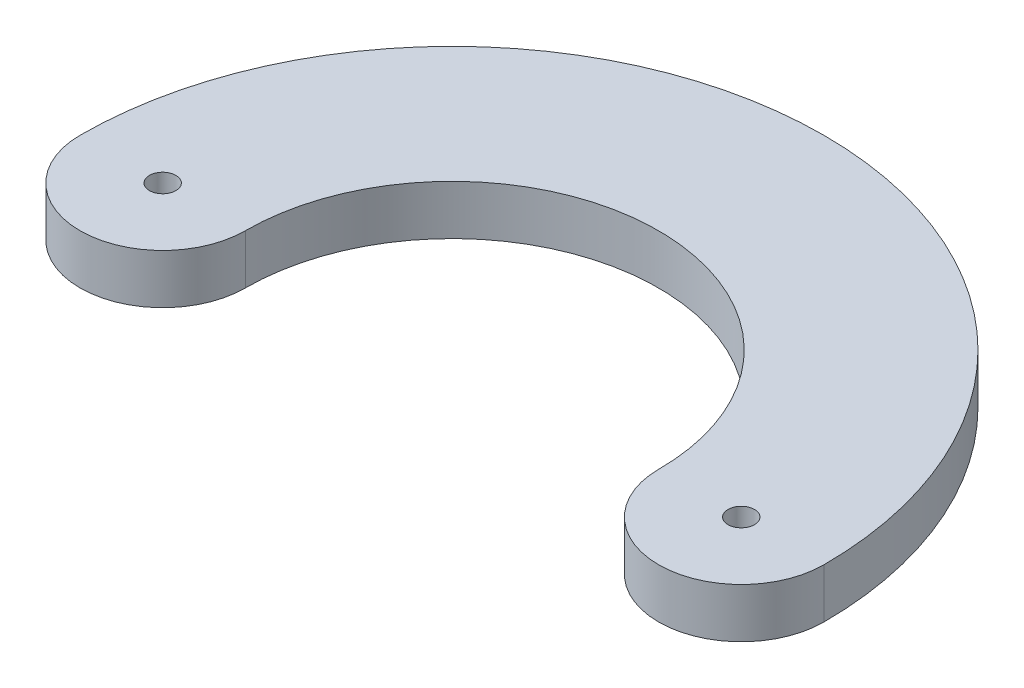
ISO-10303-21;
HEADER;
FILE_DESCRIPTION(('STEP AP214'),'2;1');
FILE_NAME('part.step','',(''),(''),'','','');
FILE_SCHEMA(('AUTOMOTIVE_DESIGN { 1 0 10303 214 1 1 1 1 }'));
ENDSEC;
DATA;
#1=APPLICATION_CONTEXT('core data for automotive mechanical design processes');
#2=APPLICATION_PROTOCOL_DEFINITION('international standard','automotive_design',2000,#1);
#3=PRODUCT_CONTEXT('',#1,'mechanical');
#4=PRODUCT('Part','Part','',(#3));
#5=PRODUCT_RELATED_PRODUCT_CATEGORY('part','',(#4));
#6=PRODUCT_DEFINITION_FORMATION('','',#4);
#7=PRODUCT_DEFINITION_CONTEXT('part definition',#1,'design');
#8=PRODUCT_DEFINITION('design','',#6,#7);
#9=PRODUCT_DEFINITION_SHAPE('','',#8);
#10=(LENGTH_UNIT() NAMED_UNIT(*) SI_UNIT(.MILLI.,.METRE.));
#11=(NAMED_UNIT(*) PLANE_ANGLE_UNIT() SI_UNIT($,.RADIAN.));
#12=(NAMED_UNIT(*) SI_UNIT($,.STERADIAN.) SOLID_ANGLE_UNIT());
#13=UNCERTAINTY_MEASURE_WITH_UNIT(LENGTH_MEASURE(1.E-05),#10,'distance_accuracy_value','');
#14=(GEOMETRIC_REPRESENTATION_CONTEXT(3) GLOBAL_UNCERTAINTY_ASSIGNED_CONTEXT((#13)) GLOBAL_UNIT_ASSIGNED_CONTEXT((#10,
#11,#12)) REPRESENTATION_CONTEXT('',''));
#15=CARTESIAN_POINT('',(0.,0.,0.));
#16=DIRECTION('',(0.,0.,1.));
#17=DIRECTION('',(1.,0.,0.));
#18=AXIS2_PLACEMENT_3D('',#15,#16,#17);
#19=CARTESIAN_POINT('',(17.5,6.,0.));
#20=DIRECTION('',(0.,1.,0.));
#21=DIRECTION('',(0.,0.,1.));
#22=AXIS2_PLACEMENT_3D('',#19,#20,#21);
#23=PLANE('',#22);
#24=CARTESIAN_POINT('',(-35.,6.,0.));
#25=DIRECTION('',(0.,1.,0.));
#26=DIRECTION('',(0.,0.,1.));
#27=AXIS2_PLACEMENT_3D('',#24,#25,#26);
#28=CIRCLE('',#27,1.60000000000001);
#29=CARTESIAN_POINT('',(-35.,6.,1.60000000000001));
#30=VERTEX_POINT('',#29);
#31=EDGE_CURVE('E109',#30,#30,#28,.T.);
#32=ORIENTED_EDGE('',*,*,#31,.F.);
#33=EDGE_LOOP('',(#32));
#34=FACE_BOUND('',#33,.T.);
#35=CARTESIAN_POINT('',(35.,6.,0.));
#36=DIRECTION('',(0.,1.,0.));
#37=DIRECTION('',(0.,0.,1.));
#38=AXIS2_PLACEMENT_3D('',#35,#36,#37);
#39=CIRCLE('',#38,10.);
#40=CARTESIAN_POINT('',(25.,6.,0.));
#41=VERTEX_POINT('',#40);
#42=CARTESIAN_POINT('',(45.,6.,0.));
#43=VERTEX_POINT('',#42);
#44=EDGE_CURVE('E85',#41,#43,#39,.T.);
#45=ORIENTED_EDGE('',*,*,#44,.T.);
#46=CARTESIAN_POINT('',(0.,6.,0.));
#47=DIRECTION('',(0.,1.,0.));
#48=DIRECTION('',(0.,0.,1.));
#49=AXIS2_PLACEMENT_3D('',#46,#47,#48);
#50=CIRCLE('',#49,45.);
#51=CARTESIAN_POINT('',(-45.,6.,0.));
#52=VERTEX_POINT('',#51);
#53=EDGE_CURVE('E80',#43,#52,#50,.T.);
#54=ORIENTED_EDGE('',*,*,#53,.T.);
#55=CARTESIAN_POINT('',(-35.,6.,0.));
#56=DIRECTION('',(0.,1.,0.));
#57=DIRECTION('',(0.,0.,1.));
#58=AXIS2_PLACEMENT_3D('',#55,#56,#57);
#59=CIRCLE('',#58,10.);
#60=CARTESIAN_POINT('',(-25.,6.,0.));
#61=VERTEX_POINT('',#60);
#62=EDGE_CURVE('E83',#52,#61,#59,.T.);
#63=ORIENTED_EDGE('',*,*,#62,.T.);
#64=CARTESIAN_POINT('',(0.,6.,0.));
#65=DIRECTION('',(0.,-1.,0.));
#66=DIRECTION('',(0.,0.,1.));
#67=AXIS2_PLACEMENT_3D('',#64,#65,#66);
#68=CIRCLE('',#67,25.);
#69=EDGE_CURVE('E50',#61,#41,#68,.T.);
#70=ORIENTED_EDGE('',*,*,#69,.T.);
#71=EDGE_LOOP('',(#45,#54,#63,#70));
#72=FACE_BOUND('',#71,.T.);
#73=CARTESIAN_POINT('',(35.,6.,0.));
#74=DIRECTION('',(0.,1.,0.));
#75=DIRECTION('',(0.,0.,1.));
#76=AXIS2_PLACEMENT_3D('',#73,#74,#75);
#77=CIRCLE('',#76,1.6);
#78=CARTESIAN_POINT('',(35.,6.,1.59999999999998));
#79=VERTEX_POINT('',#78);
#80=EDGE_CURVE('E110',#79,#79,#77,.T.);
#81=ORIENTED_EDGE('',*,*,#80,.F.);
#82=EDGE_LOOP('',(#81));
#83=FACE_BOUND('',#82,.T.);
#84=ADVANCED_FACE('F33',(#34,#72,#83),#23,.T.);
#85=CARTESIAN_POINT('',(17.5,0.,0.));
#86=DIRECTION('',(0.,1.,0.));
#87=DIRECTION('',(0.,0.,1.));
#88=AXIS2_PLACEMENT_3D('',#85,#86,#87);
#89=PLANE('',#88);
#90=CARTESIAN_POINT('',(35.,0.,0.));
#91=DIRECTION('',(0.,1.,0.));
#92=DIRECTION('',(0.,0.,1.));
#93=AXIS2_PLACEMENT_3D('',#90,#91,#92);
#94=CIRCLE('',#93,10.);
#95=CARTESIAN_POINT('',(25.,0.,0.));
#96=VERTEX_POINT('',#95);
#97=CARTESIAN_POINT('',(45.,0.,0.));
#98=VERTEX_POINT('',#97);
#99=EDGE_CURVE('E114',#96,#98,#94,.T.);
#100=ORIENTED_EDGE('',*,*,#99,.F.);
#101=CARTESIAN_POINT('',(0.,0.,0.));
#102=DIRECTION('',(0.,-1.,0.));
#103=DIRECTION('',(0.,0.,1.));
#104=AXIS2_PLACEMENT_3D('',#101,#102,#103);
#105=CIRCLE('',#104,25.);
#106=CARTESIAN_POINT('',(-25.,0.,0.));
#107=VERTEX_POINT('',#106);
#108=EDGE_CURVE('E73',#107,#96,#105,.T.);
#109=ORIENTED_EDGE('',*,*,#108,.F.);
#110=CARTESIAN_POINT('',(-35.,0.,0.));
#111=DIRECTION('',(0.,1.,0.));
#112=DIRECTION('',(0.,0.,1.));
#113=AXIS2_PLACEMENT_3D('',#110,#111,#112);
#114=CIRCLE('',#113,10.);
#115=CARTESIAN_POINT('',(-45.,0.,0.));
#116=VERTEX_POINT('',#115);
#117=EDGE_CURVE('E67',#116,#107,#114,.T.);
#118=ORIENTED_EDGE('',*,*,#117,.F.);
#119=CARTESIAN_POINT('',(0.,0.,0.));
#120=DIRECTION('',(0.,1.,0.));
#121=DIRECTION('',(0.,0.,1.));
#122=AXIS2_PLACEMENT_3D('',#119,#120,#121);
#123=CIRCLE('',#122,45.);
#124=EDGE_CURVE('E89',#98,#116,#123,.T.);
#125=ORIENTED_EDGE('',*,*,#124,.F.);
#126=EDGE_LOOP('',(#100,#109,#118,#125));
#127=FACE_BOUND('',#126,.T.);
#128=CARTESIAN_POINT('',(-35.,0.,0.));
#129=DIRECTION('',(0.,1.,0.));
#130=DIRECTION('',(0.,0.,1.));
#131=AXIS2_PLACEMENT_3D('',#128,#129,#130);
#132=CIRCLE('',#131,1.60000000000001);
#133=CARTESIAN_POINT('',(-35.,0.,1.60000000000001));
#134=VERTEX_POINT('',#133);
#135=EDGE_CURVE('E107',#134,#134,#132,.T.);
#136=ORIENTED_EDGE('',*,*,#135,.T.);
#137=EDGE_LOOP('',(#136));
#138=FACE_BOUND('',#137,.T.);
#139=CARTESIAN_POINT('',(35.,0.,0.));
#140=DIRECTION('',(0.,1.,0.));
#141=DIRECTION('',(0.,0.,1.));
#142=AXIS2_PLACEMENT_3D('',#139,#140,#141);
#143=CIRCLE('',#142,1.6);
#144=CARTESIAN_POINT('',(35.,0.,1.59999999999998));
#145=VERTEX_POINT('',#144);
#146=EDGE_CURVE('E115',#145,#145,#143,.T.);
#147=ORIENTED_EDGE('',*,*,#146,.T.);
#148=EDGE_LOOP('',(#147));
#149=FACE_BOUND('',#148,.T.);
#150=ADVANCED_FACE('F124',(#127,#138,#149),#89,.F.);
#151=CARTESIAN_POINT('',(35.,6.,0.));
#152=DIRECTION('',(0.,-1.,0.));
#153=DIRECTION('',(0.,0.,-1.));
#154=AXIS2_PLACEMENT_3D('',#151,#152,#153);
#155=CYLINDRICAL_SURFACE('',#154,10.);
#156=ORIENTED_EDGE('',*,*,#99,.T.);
#157=DIRECTION('',(0.,-1.,0.));
#158=VECTOR('',#157,1.);
#159=CARTESIAN_POINT('',(45.,6.,0.));
#160=LINE('',#159,#158);
#161=EDGE_CURVE('E12',#43,#98,#160,.T.);
#162=ORIENTED_EDGE('',*,*,#161,.F.);
#163=ORIENTED_EDGE('',*,*,#44,.F.);
#164=DIRECTION('',(0.,-1.,0.));
#165=VECTOR('',#164,1.);
#166=CARTESIAN_POINT('',(25.,6.,0.));
#167=LINE('',#166,#165);
#168=EDGE_CURVE('E93',#41,#96,#167,.T.);
#169=ORIENTED_EDGE('',*,*,#168,.T.);
#170=EDGE_LOOP('',(#156,#162,#163,#169));
#171=FACE_BOUND('',#170,.T.);
#172=ADVANCED_FACE('F35',(#171),#155,.T.);
#173=CARTESIAN_POINT('',(0.,6.,0.));
#174=DIRECTION('',(0.,-1.,0.));
#175=DIRECTION('',(0.,0.,-1.));
#176=AXIS2_PLACEMENT_3D('',#173,#174,#175);
#177=CYLINDRICAL_SURFACE('',#176,45.);
#178=ORIENTED_EDGE('',*,*,#124,.T.);
#179=DIRECTION('',(0.,-1.,0.));
#180=VECTOR('',#179,1.);
#181=CARTESIAN_POINT('',(-45.,6.,0.));
#182=LINE('',#181,#180);
#183=EDGE_CURVE('E42',#52,#116,#182,.T.);
#184=ORIENTED_EDGE('',*,*,#183,.F.);
#185=ORIENTED_EDGE('',*,*,#53,.F.);
#186=ORIENTED_EDGE('',*,*,#161,.T.);
#187=EDGE_LOOP('',(#178,#184,#185,#186));
#188=FACE_BOUND('',#187,.T.);
#189=ADVANCED_FACE('F88',(#188),#177,.T.);
#190=CARTESIAN_POINT('',(-35.,6.,0.));
#191=DIRECTION('',(0.,-1.,0.));
#192=DIRECTION('',(0.,0.,-1.));
#193=AXIS2_PLACEMENT_3D('',#190,#191,#192);
#194=CYLINDRICAL_SURFACE('',#193,10.);
#195=ORIENTED_EDGE('',*,*,#117,.T.);
#196=DIRECTION('',(0.,-1.,0.));
#197=VECTOR('',#196,1.);
#198=CARTESIAN_POINT('',(-25.,6.,0.));
#199=LINE('',#198,#197);
#200=EDGE_CURVE('E90',#61,#107,#199,.T.);
#201=ORIENTED_EDGE('',*,*,#200,.F.);
#202=ORIENTED_EDGE('',*,*,#62,.F.);
#203=ORIENTED_EDGE('',*,*,#183,.T.);
#204=EDGE_LOOP('',(#195,#201,#202,#203));
#205=FACE_BOUND('',#204,.T.);
#206=ADVANCED_FACE('F91',(#205),#194,.T.);
#207=CARTESIAN_POINT('',(0.,6.,0.));
#208=DIRECTION('',(0.,-1.,0.));
#209=DIRECTION('',(0.,0.,-1.));
#210=AXIS2_PLACEMENT_3D('',#207,#208,#209);
#211=CYLINDRICAL_SURFACE('',#210,25.);
#212=ORIENTED_EDGE('',*,*,#108,.T.);
#213=ORIENTED_EDGE('',*,*,#168,.F.);
#214=ORIENTED_EDGE('',*,*,#69,.F.);
#215=ORIENTED_EDGE('',*,*,#200,.T.);
#216=EDGE_LOOP('',(#212,#213,#214,#215));
#217=FACE_BOUND('',#216,.T.);
#218=ADVANCED_FACE('F137',(#217),#211,.F.);
#219=CARTESIAN_POINT('',(-35.,6.,0.));
#220=DIRECTION('',(0.,-1.,0.));
#221=DIRECTION('',(0.,0.,-1.));
#222=AXIS2_PLACEMENT_3D('',#219,#220,#221);
#223=CYLINDRICAL_SURFACE('',#222,1.60000000000001);
#224=ORIENTED_EDGE('',*,*,#31,.T.);
#225=EDGE_LOOP('',(#224));
#226=FACE_BOUND('',#225,.T.);
#227=ORIENTED_EDGE('',*,*,#135,.F.);
#228=EDGE_LOOP('',(#227));
#229=FACE_BOUND('',#228,.T.);
#230=ADVANCED_FACE('F134',(#226,#229),#223,.F.);
#231=CARTESIAN_POINT('',(35.,6.,0.));
#232=DIRECTION('',(0.,-1.,0.));
#233=DIRECTION('',(0.,0.,-1.));
#234=AXIS2_PLACEMENT_3D('',#231,#232,#233);
#235=CYLINDRICAL_SURFACE('',#234,1.6);
#236=ORIENTED_EDGE('',*,*,#80,.T.);
#237=EDGE_LOOP('',(#236));
#238=FACE_BOUND('',#237,.T.);
#239=ORIENTED_EDGE('',*,*,#146,.F.);
#240=EDGE_LOOP('',(#239));
#241=FACE_BOUND('',#240,.T.);
#242=ADVANCED_FACE('F121',(#238,#241),#235,.F.);
#243=CLOSED_SHELL('',(#84,#150,#172,#189,#206,#218,#230,#242));
#244=MANIFOLD_SOLID_BREP('B2',#243);
#245=ADVANCED_BREP_SHAPE_REPRESENTATION('',(#18,#244),#14);
#246=SHAPE_DEFINITION_REPRESENTATION(#9,#245);
ENDSEC;
END-ISO-10303-21;
